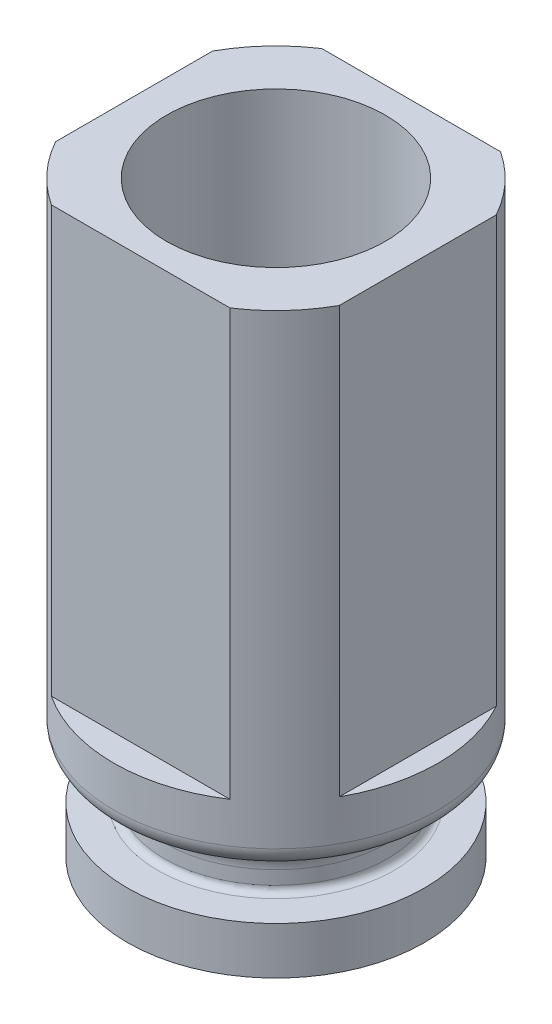
ISO-10303-21;
HEADER;
FILE_DESCRIPTION(('STEP AP214'),'2;1');
FILE_NAME('part.step','',(''),(''),'','','');
FILE_SCHEMA(('AUTOMOTIVE_DESIGN { 1 0 10303 214 1 1 1 1 }'));
ENDSEC;
DATA;
#1=APPLICATION_CONTEXT('core data for automotive mechanical design processes');
#2=APPLICATION_PROTOCOL_DEFINITION('international standard','automotive_design',2000,#1);
#3=PRODUCT_CONTEXT('',#1,'mechanical');
#4=PRODUCT('Part','Part','',(#3));
#5=PRODUCT_RELATED_PRODUCT_CATEGORY('part','',(#4));
#6=PRODUCT_DEFINITION_FORMATION('','',#4);
#7=PRODUCT_DEFINITION_CONTEXT('part definition',#1,'design');
#8=PRODUCT_DEFINITION('design','',#6,#7);
#9=PRODUCT_DEFINITION_SHAPE('','',#8);
#10=(LENGTH_UNIT() NAMED_UNIT(*) SI_UNIT(.MILLI.,.METRE.));
#11=(NAMED_UNIT(*) PLANE_ANGLE_UNIT() SI_UNIT($,.RADIAN.));
#12=(NAMED_UNIT(*) SI_UNIT($,.STERADIAN.) SOLID_ANGLE_UNIT());
#13=UNCERTAINTY_MEASURE_WITH_UNIT(LENGTH_MEASURE(1.E-05),#10,'distance_accuracy_value','');
#14=(GEOMETRIC_REPRESENTATION_CONTEXT(3) GLOBAL_UNCERTAINTY_ASSIGNED_CONTEXT((#13)) GLOBAL_UNIT_ASSIGNED_CONTEXT((#10,
#11,#12)) REPRESENTATION_CONTEXT('',''));
#15=CARTESIAN_POINT('',(0.,0.,0.));
#16=DIRECTION('',(0.,0.,1.));
#17=DIRECTION('',(1.,0.,0.));
#18=AXIS2_PLACEMENT_3D('',#15,#16,#17);
#19=CARTESIAN_POINT('',(0.,87.,0.));
#20=DIRECTION('',(0.,1.,0.));
#21=DIRECTION('',(0.,0.,1.));
#22=AXIS2_PLACEMENT_3D('',#19,#20,#21);
#23=PLANE('',#22);
#24=CARTESIAN_POINT('',(0.,87.,0.));
#25=DIRECTION('',(0.,1.,0.));
#26=DIRECTION('',(0.,0.,1.));
#27=AXIS2_PLACEMENT_3D('',#24,#25,#26);
#28=CIRCLE('',#27,16.2);
#29=CARTESIAN_POINT('',(0.,87.,16.2));
#30=VERTEX_POINT('',#29);
#31=EDGE_CURVE('E149',#30,#30,#28,.T.);
#32=ORIENTED_EDGE('',*,*,#31,.F.);
#33=EDGE_LOOP('',(#32));
#34=FACE_BOUND('',#33,.T.);
#35=CARTESIAN_POINT('',(0.,87.,0.));
#36=DIRECTION('',(0.,1.,0.));
#37=DIRECTION('',(0.,0.,1.));
#38=AXIS2_PLACEMENT_3D('',#35,#36,#37);
#39=CIRCLE('',#38,24.);
#40=CARTESIAN_POINT('',(21.,87.,-11.6189500386223));
#41=VERTEX_POINT('',#40);
#42=CARTESIAN_POINT('',(13.2177418201175,87.,-20.0322565173451));
#43=VERTEX_POINT('',#42);
#44=EDGE_CURVE('E148',#41,#43,#39,.T.);
#45=ORIENTED_EDGE('',*,*,#44,.T.);
#46=DIRECTION('',(-1.,0.,0.));
#47=VECTOR('',#46,1.);
#48=CARTESIAN_POINT('',(0.,87.,-20.0322565173451));
#49=LINE('',#48,#47);
#50=CARTESIAN_POINT('',(-13.2177418201175,87.,-20.0322565173451));
#51=VERTEX_POINT('',#50);
#52=EDGE_CURVE('E143',#43,#51,#49,.T.);
#53=ORIENTED_EDGE('',*,*,#52,.T.);
#54=CARTESIAN_POINT('',(-21.,87.,-11.6189500386223));
#55=VERTEX_POINT('',#54);
#56=EDGE_CURVE('E146',#51,#55,#39,.T.);
#57=ORIENTED_EDGE('',*,*,#56,.T.);
#58=DIRECTION('',(0.,0.,1.));
#59=VECTOR('',#58,1.);
#60=CARTESIAN_POINT('',(-21.,87.,0.));
#61=LINE('',#60,#59);
#62=CARTESIAN_POINT('',(-21.,87.,11.6189500386222));
#63=VERTEX_POINT('',#62);
#64=EDGE_CURVE('E101',#55,#63,#61,.T.);
#65=ORIENTED_EDGE('',*,*,#64,.T.);
#66=CARTESIAN_POINT('',(-13.2177418201175,87.,20.0322565173451));
#67=VERTEX_POINT('',#66);
#68=EDGE_CURVE('E152',#63,#67,#39,.T.);
#69=ORIENTED_EDGE('',*,*,#68,.T.);
#70=DIRECTION('',(1.,0.,0.));
#71=VECTOR('',#70,1.);
#72=CARTESIAN_POINT('',(0.,87.,20.0322565173451));
#73=LINE('',#72,#71);
#74=CARTESIAN_POINT('',(13.2177418201175,87.,20.0322565173451));
#75=VERTEX_POINT('',#74);
#76=EDGE_CURVE('E407',#67,#75,#73,.T.);
#77=ORIENTED_EDGE('',*,*,#76,.T.);
#78=CARTESIAN_POINT('',(21.,87.,11.6189500386222));
#79=VERTEX_POINT('',#78);
#80=EDGE_CURVE('E154',#75,#79,#39,.T.);
#81=ORIENTED_EDGE('',*,*,#80,.T.);
#82=DIRECTION('',(0.,0.,-1.));
#83=VECTOR('',#82,1.);
#84=CARTESIAN_POINT('',(21.,87.,0.));
#85=LINE('',#84,#83);
#86=EDGE_CURVE('E150',#79,#41,#85,.T.);
#87=ORIENTED_EDGE('',*,*,#86,.T.);
#88=EDGE_LOOP('',(#45,#53,#57,#65,#69,#77,#81,#87));
#89=FACE_BOUND('',#88,.T.);
#90=ADVANCED_FACE('F32',(#34,#89),#23,.T.);
#91=CARTESIAN_POINT('',(0.,87.,0.));
#92=DIRECTION('',(0.,-1.,0.));
#93=DIRECTION('',(0.,0.,-1.));
#94=AXIS2_PLACEMENT_3D('',#91,#92,#93);
#95=CYLINDRICAL_SURFACE('',#94,24.);
#96=CARTESIAN_POINT('',(0.,17.9843597113357,0.));
#97=DIRECTION('',(0.,-1.,0.));
#98=DIRECTION('',(0.,0.,-1.));
#99=AXIS2_PLACEMENT_3D('',#96,#97,#98);
#100=CIRCLE('',#99,24.);
#101=CARTESIAN_POINT('',(0.,17.9843597113357,-24.));
#102=VERTEX_POINT('',#101);
#103=EDGE_CURVE('E183',#102,#102,#100,.F.);
#104=ORIENTED_EDGE('',*,*,#103,.T.);
#105=EDGE_LOOP('',(#104));
#106=FACE_BOUND('',#105,.T.);
#107=DIRECTION('',(0.,-1.,0.));
#108=VECTOR('',#107,1.);
#109=CARTESIAN_POINT('',(13.2177418201175,87.,-20.0322565173451));
#110=LINE('',#109,#108);
#111=CARTESIAN_POINT('',(13.2177418201175,24.,-20.0322565173451));
#112=VERTEX_POINT('',#111);
#113=EDGE_CURVE('E11',#43,#112,#110,.T.);
#114=ORIENTED_EDGE('',*,*,#113,.F.);
#115=ORIENTED_EDGE('',*,*,#44,.F.);
#116=DIRECTION('',(0.,-1.,0.));
#117=VECTOR('',#116,1.);
#118=CARTESIAN_POINT('',(21.,87.,-11.6189500386223));
#119=LINE('',#118,#117);
#120=CARTESIAN_POINT('',(21.,24.,-11.6189500386223));
#121=VERTEX_POINT('',#120);
#122=EDGE_CURVE('E130',#121,#41,#119,.F.);
#123=ORIENTED_EDGE('',*,*,#122,.F.);
#124=CARTESIAN_POINT('',(0.,24.,0.));
#125=DIRECTION('',(0.,-1.,0.));
#126=DIRECTION('',(0.,0.,-1.));
#127=AXIS2_PLACEMENT_3D('',#124,#125,#126);
#128=CIRCLE('',#127,24.);
#129=CARTESIAN_POINT('',(21.,24.,11.6189500386222));
#130=VERTEX_POINT('',#129);
#131=EDGE_CURVE('E124',#121,#130,#128,.T.);
#132=ORIENTED_EDGE('',*,*,#131,.T.);
#133=DIRECTION('',(0.,-1.,0.));
#134=VECTOR('',#133,1.);
#135=CARTESIAN_POINT('',(21.,87.,11.6189500386222));
#136=LINE('',#135,#134);
#137=EDGE_CURVE('E134',#79,#130,#136,.T.);
#138=ORIENTED_EDGE('',*,*,#137,.F.);
#139=ORIENTED_EDGE('',*,*,#80,.F.);
#140=DIRECTION('',(0.,-1.,0.));
#141=VECTOR('',#140,1.);
#142=CARTESIAN_POINT('',(13.2177418201175,87.,20.0322565173451));
#143=LINE('',#142,#141);
#144=CARTESIAN_POINT('',(13.2177418201175,24.,20.0322565173451));
#145=VERTEX_POINT('',#144);
#146=EDGE_CURVE('E106',#145,#75,#143,.F.);
#147=ORIENTED_EDGE('',*,*,#146,.F.);
#148=CARTESIAN_POINT('',(-13.2177418201175,24.,20.0322565173451));
#149=VERTEX_POINT('',#148);
#150=EDGE_CURVE('E119',#145,#149,#128,.T.);
#151=ORIENTED_EDGE('',*,*,#150,.T.);
#152=DIRECTION('',(0.,-1.,0.));
#153=VECTOR('',#152,1.);
#154=CARTESIAN_POINT('',(-13.2177418201175,87.,20.0322565173451));
#155=LINE('',#154,#153);
#156=EDGE_CURVE('E126',#67,#149,#155,.T.);
#157=ORIENTED_EDGE('',*,*,#156,.F.);
#158=ORIENTED_EDGE('',*,*,#68,.F.);
#159=DIRECTION('',(0.,-1.,0.));
#160=VECTOR('',#159,1.);
#161=CARTESIAN_POINT('',(-21.,87.,11.6189500386222));
#162=LINE('',#161,#160);
#163=CARTESIAN_POINT('',(-21.,24.,11.6189500386222));
#164=VERTEX_POINT('',#163);
#165=EDGE_CURVE('E117',#164,#63,#162,.F.);
#166=ORIENTED_EDGE('',*,*,#165,.F.);
#167=CARTESIAN_POINT('',(-21.,24.,-11.6189500386223));
#168=VERTEX_POINT('',#167);
#169=EDGE_CURVE('E107',#164,#168,#128,.T.);
#170=ORIENTED_EDGE('',*,*,#169,.T.);
#171=DIRECTION('',(0.,-1.,0.));
#172=VECTOR('',#171,1.);
#173=CARTESIAN_POINT('',(-21.,87.,-11.6189500386223));
#174=LINE('',#173,#172);
#175=EDGE_CURVE('E95',#55,#168,#174,.T.);
#176=ORIENTED_EDGE('',*,*,#175,.F.);
#177=ORIENTED_EDGE('',*,*,#56,.F.);
#178=DIRECTION('',(0.,-1.,0.));
#179=VECTOR('',#178,1.);
#180=CARTESIAN_POINT('',(-13.2177418201175,87.,-20.0322565173451));
#181=LINE('',#180,#179);
#182=CARTESIAN_POINT('',(-13.2177418201175,24.,-20.0322565173451));
#183=VERTEX_POINT('',#182);
#184=EDGE_CURVE('E123',#183,#51,#181,.F.);
#185=ORIENTED_EDGE('',*,*,#184,.F.);
#186=EDGE_CURVE('E40',#183,#112,#128,.T.);
#187=ORIENTED_EDGE('',*,*,#186,.T.);
#188=EDGE_LOOP('',(#114,#115,#123,#132,#138,#139,#147,#151,#157,#158,#166,#170,#176,#177,#185,#187));
#189=FACE_BOUND('',#188,.T.);
#190=ADVANCED_FACE('F115',(#106,#189),#95,.T.);
#191=CARTESIAN_POINT('',(0.,15.,0.));
#192=DIRECTION('',(0.,-1.,0.));
#193=DIRECTION('',(0.,0.,-1.));
#194=AXIS2_PLACEMENT_3D('',#191,#192,#193);
#195=CYLINDRICAL_SURFACE('',#194,22.);
#196=CARTESIAN_POINT('',(0.,0.,0.));
#197=DIRECTION('',(0.,1.,0.));
#198=DIRECTION('',(0.,0.,1.));
#199=AXIS2_PLACEMENT_3D('',#196,#197,#198);
#200=CIRCLE('',#199,22.);
#201=CARTESIAN_POINT('',(0.,0.,22.));
#202=VERTEX_POINT('',#201);
#203=EDGE_CURVE('E163',#202,#202,#200,.T.);
#204=ORIENTED_EDGE('',*,*,#203,.T.);
#205=EDGE_LOOP('',(#204));
#206=FACE_BOUND('',#205,.T.);
#207=CARTESIAN_POINT('',(0.,7.,0.));
#208=DIRECTION('',(0.,1.,0.));
#209=DIRECTION('',(0.,0.,1.));
#210=AXIS2_PLACEMENT_3D('',#207,#208,#209);
#211=CIRCLE('',#210,22.);
#212=CARTESIAN_POINT('',(0.,7.,22.));
#213=VERTEX_POINT('',#212);
#214=EDGE_CURVE('E159',#213,#213,#211,.T.);
#215=ORIENTED_EDGE('',*,*,#214,.F.);
#216=EDGE_LOOP('',(#215));
#217=FACE_BOUND('',#216,.T.);
#218=ADVANCED_FACE('F197',(#206,#217),#195,.T.);
#219=CARTESIAN_POINT('',(0.,0.,0.));
#220=DIRECTION('',(0.,1.,0.));
#221=DIRECTION('',(0.,0.,1.));
#222=AXIS2_PLACEMENT_3D('',#219,#220,#221);
#223=PLANE('',#222);
#224=CARTESIAN_POINT('',(0.,0.,0.));
#225=DIRECTION('',(0.,-1.,0.));
#226=DIRECTION('',(0.,0.,-1.));
#227=AXIS2_PLACEMENT_3D('',#224,#225,#226);
#228=CIRCLE('',#227,14.5);
#229=CARTESIAN_POINT('',(0.,0.,-14.5));
#230=VERTEX_POINT('',#229);
#231=EDGE_CURVE('E164',#230,#230,#228,.T.);
#232=ORIENTED_EDGE('',*,*,#231,.F.);
#233=EDGE_LOOP('',(#232));
#234=FACE_BOUND('',#233,.T.);
#235=ORIENTED_EDGE('',*,*,#203,.F.);
#236=EDGE_LOOP('',(#235));
#237=FACE_BOUND('',#236,.T.);
#238=ADVANCED_FACE('F203',(#234,#237),#223,.F.);
#239=CARTESIAN_POINT('',(0.,6.5,0.));
#240=DIRECTION('',(0.,-1.,0.));
#241=DIRECTION('',(0.,0.,-1.));
#242=AXIS2_PLACEMENT_3D('',#239,#240,#241);
#243=CYLINDRICAL_SURFACE('',#242,14.5);
#244=CARTESIAN_POINT('',(0.,6.5,0.));
#245=DIRECTION('',(0.,-1.,0.));
#246=DIRECTION('',(0.,0.,-1.));
#247=AXIS2_PLACEMENT_3D('',#244,#245,#246);
#248=CIRCLE('',#247,14.5);
#249=CARTESIAN_POINT('',(0.,6.5,-14.5));
#250=VERTEX_POINT('',#249);
#251=EDGE_CURVE('E160',#250,#250,#248,.T.);
#252=CARTESIAN_POINT('',(0.,6.5,-14.5));
#253=CARTESIAN_POINT('',(0.,6.43229166666667,-14.5));
#254=CARTESIAN_POINT('',(0.,6.36458333333333,-14.5));
#255=CARTESIAN_POINT('',(0.,6.22916666666667,-14.5));
#256=CARTESIAN_POINT('',(0.,6.16145833333333,-14.5));
#257=CARTESIAN_POINT('',(0.,6.02604166666667,-14.5));
#258=CARTESIAN_POINT('',(0.,5.95833333333333,-14.5));
#259=CARTESIAN_POINT('',(0.,5.82291666666667,-14.5));
#260=CARTESIAN_POINT('',(0.,5.75520833333333,-14.5));
#261=CARTESIAN_POINT('',(0.,5.61979166666667,-14.5));
#262=CARTESIAN_POINT('',(0.,5.55208333333333,-14.5));
#263=CARTESIAN_POINT('',(0.,5.41666666666667,-14.5));
#264=CARTESIAN_POINT('',(0.,5.34895833333333,-14.5));
#265=CARTESIAN_POINT('',(0.,5.21354166666667,-14.5));
#266=CARTESIAN_POINT('',(0.,5.14583333333333,-14.5));
#267=CARTESIAN_POINT('',(0.,5.01041666666667,-14.5));
#268=CARTESIAN_POINT('',(0.,4.94270833333333,-14.5));
#269=CARTESIAN_POINT('',(0.,4.80729166666667,-14.5));
#270=CARTESIAN_POINT('',(0.,4.73958333333333,-14.5));
#271=CARTESIAN_POINT('',(0.,4.60416666666667,-14.5));
#272=CARTESIAN_POINT('',(0.,4.53645833333333,-14.5));
#273=CARTESIAN_POINT('',(0.,4.40104166666667,-14.5));
#274=CARTESIAN_POINT('',(0.,4.33333333333333,-14.5));
#275=CARTESIAN_POINT('',(0.,4.19791666666667,-14.5));
#276=CARTESIAN_POINT('',(0.,4.13020833333333,-14.5));
#277=CARTESIAN_POINT('',(0.,3.99479166666667,-14.5));
#278=CARTESIAN_POINT('',(0.,3.92708333333333,-14.5));
#279=CARTESIAN_POINT('',(0.,3.79166666666667,-14.5));
#280=CARTESIAN_POINT('',(0.,3.72395833333333,-14.5));
#281=CARTESIAN_POINT('',(0.,3.58854166666667,-14.5));
#282=CARTESIAN_POINT('',(0.,3.52083333333333,-14.5));
#283=CARTESIAN_POINT('',(0.,3.38541666666667,-14.5));
#284=CARTESIAN_POINT('',(0.,3.31770833333333,-14.5));
#285=CARTESIAN_POINT('',(0.,3.18229166666667,-14.5));
#286=CARTESIAN_POINT('',(0.,3.11458333333333,-14.5));
#287=CARTESIAN_POINT('',(0.,2.97916666666667,-14.5));
#288=CARTESIAN_POINT('',(0.,2.91145833333333,-14.5));
#289=CARTESIAN_POINT('',(0.,2.77604166666667,-14.5));
#290=CARTESIAN_POINT('',(0.,2.70833333333333,-14.5));
#291=CARTESIAN_POINT('',(0.,2.57291666666667,-14.5));
#292=CARTESIAN_POINT('',(0.,2.50520833333333,-14.5));
#293=CARTESIAN_POINT('',(0.,2.36979166666667,-14.5));
#294=CARTESIAN_POINT('',(0.,2.30208333333333,-14.5));
#295=CARTESIAN_POINT('',(0.,2.16666666666667,-14.5));
#296=CARTESIAN_POINT('',(0.,2.09895833333333,-14.5));
#297=CARTESIAN_POINT('',(0.,1.96354166666667,-14.5));
#298=CARTESIAN_POINT('',(0.,1.89583333333333,-14.5));
#299=CARTESIAN_POINT('',(0.,1.76041666666667,-14.5));
#300=CARTESIAN_POINT('',(0.,1.69270833333333,-14.5));
#301=CARTESIAN_POINT('',(0.,1.55729166666667,-14.5));
#302=CARTESIAN_POINT('',(0.,1.48958333333333,-14.5));
#303=CARTESIAN_POINT('',(0.,1.35416666666667,-14.5));
#304=CARTESIAN_POINT('',(0.,1.28645833333333,-14.5));
#305=CARTESIAN_POINT('',(0.,1.15104166666667,-14.5));
#306=CARTESIAN_POINT('',(0.,1.08333333333333,-14.5));
#307=CARTESIAN_POINT('',(0.,0.947916666666667,-14.5));
#308=CARTESIAN_POINT('',(0.,0.880208333333333,-14.5));
#309=CARTESIAN_POINT('',(0.,0.744791666666667,-14.5));
#310=CARTESIAN_POINT('',(0.,0.677083333333334,-14.5));
#311=CARTESIAN_POINT('',(0.,0.541666666666667,-14.5));
#312=CARTESIAN_POINT('',(0.,0.473958333333334,-14.5));
#313=CARTESIAN_POINT('',(0.,0.338541666666667,-14.5));
#314=CARTESIAN_POINT('',(0.,0.270833333333334,-14.5));
#315=CARTESIAN_POINT('',(0.,0.135416666666667,-14.5));
#316=CARTESIAN_POINT('',(0.,0.0677083333333333,-14.5));
#317=CARTESIAN_POINT('',(0.,0.,-14.5));
#318=B_SPLINE_CURVE_WITH_KNOTS('',3,(#252,#253,#254,#255,#256,#257,#258,#259,#260,#261,#262,
#263,#264,#265,#266,#267,#268,#269,#270,#271,#272,#273,#274,#275,#276,#277,#278,#279,#280,#281,
#282,#283,#284,#285,#286,#287,#288,#289,#290,#291,#292,#293,#294,#295,#296,#297,#298,#299,#300,
#301,#302,#303,#304,#305,#306,#307,#308,#309,#310,#311,#312,#313,#314,#315,#316,#317),
.UNSPECIFIED.,.F.,.F.,(4,2,2,2,2,2,2,2,2,2,2,2,2,2,2,2,2,2,2,2,2,2,2,2,2,2,2,2,2,2,2,2,4),(0.,
0.203125,0.40625,0.609375000000001,0.812500000000001,1.015625,1.21875,1.421875,1.625,1.828125,
2.03125,2.234375,2.4375,2.640625,2.84375,3.046875,3.25,3.453125,3.65625,3.859375,4.0625,
4.265625,4.46875,4.671875,4.875,5.078125,5.28125,5.484375,5.6875,5.890625,6.09375,6.296875,6.5),.UNSPECIFIED.);
#319=EDGE_CURVE('BSEAM222',#250,#230,#318,.T.);
#320=ORIENTED_EDGE('',*,*,#251,.F.);
#321=ORIENTED_EDGE('',*,*,#231,.T.);
#322=ORIENTED_EDGE('',*,*,#319,.T.);
#323=ORIENTED_EDGE('',*,*,#319,.F.);
#324=EDGE_LOOP('',(#320,#322,#321,#323));
#325=FACE_BOUND('',#324,.T.);
#326=ADVANCED_FACE('F222',(#325),#243,.F.);
#327=CARTESIAN_POINT('',(0.,6.5,0.));
#328=DIRECTION('',(0.,-1.,0.));
#329=DIRECTION('',(0.,0.,-1.));
#330=AXIS2_PLACEMENT_3D('',#327,#328,#329);
#331=PLANE('',#330);
#332=ORIENTED_EDGE('',*,*,#251,.T.);
#333=EDGE_LOOP('',(#332));
#334=FACE_BOUND('',#333,.T.);
#335=ADVANCED_FACE('F218',(#334),#331,.T.);
#336=CARTESIAN_POINT('',(0.,7.,0.));
#337=DIRECTION('',(0.,1.,0.));
#338=DIRECTION('',(0.,0.,1.));
#339=AXIS2_PLACEMENT_3D('',#336,#337,#338);
#340=PLANE('',#339);
#341=CARTESIAN_POINT('',(0.,7.,0.));
#342=DIRECTION('',(0.,1.,0.));
#343=DIRECTION('',(0.,0.,1.));
#344=AXIS2_PLACEMENT_3D('',#341,#342,#343);
#345=CIRCLE('',#344,17.5);
#346=CARTESIAN_POINT('',(0.,7.,17.5));
#347=VERTEX_POINT('',#346);
#348=EDGE_CURVE('E177',#347,#347,#345,.F.);
#349=ORIENTED_EDGE('',*,*,#348,.T.);
#350=EDGE_LOOP('',(#349));
#351=FACE_BOUND('',#350,.T.);
#352=ORIENTED_EDGE('',*,*,#214,.T.);
#353=EDGE_LOOP('',(#352));
#354=FACE_BOUND('',#353,.T.);
#355=ADVANCED_FACE('F214',(#351,#354),#340,.T.);
#356=CARTESIAN_POINT('',(0.,7.,0.));
#357=DIRECTION('',(0.,1.,0.));
#358=DIRECTION('',(0.,0.,1.));
#359=AXIS2_PLACEMENT_3D('',#356,#357,#358);
#360=CYLINDRICAL_SURFACE('',#359,16.5);
#361=CARTESIAN_POINT('',(0.,10.,0.));
#362=DIRECTION('',(0.,1.,0.));
#363=DIRECTION('',(0.,0.,1.));
#364=AXIS2_PLACEMENT_3D('',#361,#362,#363);
#365=CIRCLE('',#364,16.5);
#366=CARTESIAN_POINT('',(0.,10.,16.5));
#367=VERTEX_POINT('',#366);
#368=EDGE_CURVE('E180',#367,#367,#365,.F.);
#369=ORIENTED_EDGE('',*,*,#368,.T.);
#370=EDGE_LOOP('',(#369));
#371=FACE_BOUND('',#370,.T.);
#372=CARTESIAN_POINT('',(0.,8.,0.));
#373=DIRECTION('',(0.,1.,0.));
#374=DIRECTION('',(0.,0.,1.));
#375=AXIS2_PLACEMENT_3D('',#372,#373,#374);
#376=CIRCLE('',#375,16.5);
#377=CARTESIAN_POINT('',(0.,8.,16.5));
#378=VERTEX_POINT('',#377);
#379=EDGE_CURVE('E174',#378,#378,#376,.T.);
#380=ORIENTED_EDGE('',*,*,#379,.T.);
#381=EDGE_LOOP('',(#380));
#382=FACE_BOUND('',#381,.T.);
#383=ADVANCED_FACE('F210',(#371,#382),#360,.T.);
#384=CARTESIAN_POINT('',(0.,87.,0.));
#385=DIRECTION('',(0.,-1.,0.));
#386=DIRECTION('',(0.,0.,-1.));
#387=AXIS2_PLACEMENT_3D('',#384,#385,#386);
#388=CYLINDRICAL_SURFACE('',#387,16.2);
#389=ORIENTED_EDGE('',*,*,#31,.T.);
#390=EDGE_LOOP('',(#389));
#391=FACE_BOUND('',#390,.T.);
#392=CARTESIAN_POINT('',(0.,15.,0.));
#393=DIRECTION('',(0.,1.,0.));
#394=DIRECTION('',(0.,0.,1.));
#395=AXIS2_PLACEMENT_3D('',#392,#393,#394);
#396=CIRCLE('',#395,16.2);
#397=CARTESIAN_POINT('',(0.,15.,16.2));
#398=VERTEX_POINT('',#397);
#399=EDGE_CURVE('E169',#398,#398,#396,.F.);
#400=ORIENTED_EDGE('',*,*,#399,.T.);
#401=EDGE_LOOP('',(#400));
#402=FACE_BOUND('',#401,.T.);
#403=ADVANCED_FACE('F213',(#391,#402),#388,.F.);
#404=CARTESIAN_POINT('',(0.,15.,0.));
#405=DIRECTION('',(0.,1.,0.));
#406=DIRECTION('',(0.,0.,1.));
#407=AXIS2_PLACEMENT_3D('',#404,#405,#406);
#408=PLANE('',#407);
#409=ORIENTED_EDGE('',*,*,#399,.F.);
#410=EDGE_LOOP('',(#409));
#411=FACE_BOUND('',#410,.T.);
#412=ADVANCED_FACE('F227',(#411),#408,.T.);
#413=CARTESIAN_POINT('',(0.,8.,0.));
#414=DIRECTION('',(0.,1.,0.));
#415=DIRECTION('',(0.,0.,1.));
#416=AXIS2_PLACEMENT_3D('',#413,#414,#415);
#417=TOROIDAL_SURFACE('',#416,17.5,1.);
#418=ORIENTED_EDGE('',*,*,#348,.F.);
#419=EDGE_LOOP('',(#418));
#420=FACE_BOUND('',#419,.T.);
#421=ORIENTED_EDGE('',*,*,#379,.F.);
#422=EDGE_LOOP('',(#421));
#423=FACE_BOUND('',#422,.T.);
#424=ADVANCED_FACE('F230',(#420,#423),#417,.F.);
#425=CARTESIAN_POINT('',(0.,10.,0.));
#426=DIRECTION('',(0.,1.,0.));
#427=DIRECTION('',(0.,0.,1.));
#428=AXIS2_PLACEMENT_3D('',#425,#426,#427);
#429=TOROIDAL_SURFACE('',#428,21.5,5.);
#430=CARTESIAN_POINT('',(0.,14.9902248195832,0.));
#431=DIRECTION('',(0.,-1.,0.));
#432=DIRECTION('',(0.,0.,-1.));
#433=AXIS2_PLACEMENT_3D('',#430,#431,#432);
#434=CIRCLE('',#433,21.1875000000001);
#435=CARTESIAN_POINT('',(0.,14.9902248195832,-21.1875000000001));
#436=VERTEX_POINT('',#435);
#437=EDGE_CURVE('E120',#436,#436,#434,.T.);
#438=ORIENTED_EDGE('',*,*,#437,.T.);
#439=EDGE_LOOP('',(#438));
#440=FACE_BOUND('',#439,.T.);
#441=ORIENTED_EDGE('',*,*,#368,.F.);
#442=EDGE_LOOP('',(#441));
#443=FACE_BOUND('',#442,.T.);
#444=ADVANCED_FACE('F189',(#440,#443),#429,.F.);
#445=CARTESIAN_POINT('',(0.,17.9843597113357,0.));
#446=DIRECTION('',(0.,-1.,0.));
#447=DIRECTION('',(0.,0.,-1.));
#448=AXIS2_PLACEMENT_3D('',#445,#446,#447);
#449=TOROIDAL_SURFACE('',#448,21.,3.);
#450=ORIENTED_EDGE('',*,*,#437,.F.);
#451=EDGE_LOOP('',(#450));
#452=FACE_BOUND('',#451,.T.);
#453=ORIENTED_EDGE('',*,*,#103,.F.);
#454=EDGE_LOOP('',(#453));
#455=FACE_BOUND('',#454,.T.);
#456=ADVANCED_FACE('F34',(#452,#455),#449,.T.);
#457=CARTESIAN_POINT('',(-21.,24.,-20.0322565173451));
#458=DIRECTION('',(-1.,0.,0.));
#459=DIRECTION('',(0.,0.,1.));
#460=AXIS2_PLACEMENT_3D('',#457,#458,#459);
#461=PLANE('',#460);
#462=ORIENTED_EDGE('',*,*,#175,.T.);
#463=DIRECTION('',(0.,0.,1.));
#464=VECTOR('',#463,1.);
#465=CARTESIAN_POINT('',(-21.,24.,-20.0322565173451));
#466=LINE('',#465,#464);
#467=EDGE_CURVE('E98',#168,#164,#466,.T.);
#468=ORIENTED_EDGE('',*,*,#467,.T.);
#469=ORIENTED_EDGE('',*,*,#165,.T.);
#470=ORIENTED_EDGE('',*,*,#64,.F.);
#471=EDGE_LOOP('',(#462,#468,#469,#470));
#472=FACE_BOUND('',#471,.T.);
#473=ADVANCED_FACE('F97',(#472),#461,.T.);
#474=CARTESIAN_POINT('',(36.425926693778,24.,-29.701884449259));
#475=DIRECTION('',(0.,-1.,0.));
#476=DIRECTION('',(0.,0.,-1.));
#477=AXIS2_PLACEMENT_3D('',#474,#475,#476);
#478=PLANE('',#477);
#479=ORIENTED_EDGE('',*,*,#467,.F.);
#480=ORIENTED_EDGE('',*,*,#169,.F.);
#481=EDGE_LOOP('',(#479,#480));
#482=FACE_BOUND('',#481,.T.);
#483=ADVANCED_FACE('F110',(#482),#478,.F.);
#484=CARTESIAN_POINT('',(-21.,24.,20.0322565173451));
#485=DIRECTION('',(0.,0.,1.));
#486=DIRECTION('',(1.,0.,0.));
#487=AXIS2_PLACEMENT_3D('',#484,#485,#486);
#488=PLANE('',#487);
#489=ORIENTED_EDGE('',*,*,#156,.T.);
#490=DIRECTION('',(1.,0.,0.));
#491=VECTOR('',#490,1.);
#492=CARTESIAN_POINT('',(-21.,24.,20.0322565173451));
#493=LINE('',#492,#491);
#494=EDGE_CURVE('E112',#149,#145,#493,.T.);
#495=ORIENTED_EDGE('',*,*,#494,.T.);
#496=ORIENTED_EDGE('',*,*,#146,.T.);
#497=ORIENTED_EDGE('',*,*,#76,.F.);
#498=EDGE_LOOP('',(#489,#495,#496,#497));
#499=FACE_BOUND('',#498,.T.);
#500=ADVANCED_FACE('F260',(#499),#488,.T.);
#501=ORIENTED_EDGE('',*,*,#494,.F.);
#502=ORIENTED_EDGE('',*,*,#150,.F.);
#503=EDGE_LOOP('',(#501,#502));
#504=FACE_BOUND('',#503,.T.);
#505=ADVANCED_FACE('F263',(#504),#478,.F.);
#506=CARTESIAN_POINT('',(21.,24.,-20.0322565173451));
#507=DIRECTION('',(1.,0.,0.));
#508=DIRECTION('',(0.,0.,-1.));
#509=AXIS2_PLACEMENT_3D('',#506,#507,#508);
#510=PLANE('',#509);
#511=ORIENTED_EDGE('',*,*,#137,.T.);
#512=DIRECTION('',(0.,0.,-1.));
#513=VECTOR('',#512,1.);
#514=CARTESIAN_POINT('',(21.,24.,-20.0322565173451));
#515=LINE('',#514,#513);
#516=EDGE_CURVE('E54',#130,#121,#515,.T.);
#517=ORIENTED_EDGE('',*,*,#516,.T.);
#518=ORIENTED_EDGE('',*,*,#122,.T.);
#519=ORIENTED_EDGE('',*,*,#86,.F.);
#520=EDGE_LOOP('',(#511,#517,#518,#519));
#521=FACE_BOUND('',#520,.T.);
#522=ADVANCED_FACE('F276',(#521),#510,.T.);
#523=ORIENTED_EDGE('',*,*,#516,.F.);
#524=ORIENTED_EDGE('',*,*,#131,.F.);
#525=EDGE_LOOP('',(#523,#524));
#526=FACE_BOUND('',#525,.T.);
#527=ADVANCED_FACE('F278',(#526),#478,.F.);
#528=DIRECTION('',(-1.,0.,0.));
#529=VECTOR('',#528,1.);
#530=CARTESIAN_POINT('',(-21.,24.,-20.0322565173451));
#531=LINE('',#530,#529);
#532=EDGE_CURVE('E46',#112,#183,#531,.T.);
#533=ORIENTED_EDGE('',*,*,#532,.F.);
#534=ORIENTED_EDGE('',*,*,#186,.F.);
#535=EDGE_LOOP('',(#533,#534));
#536=FACE_BOUND('',#535,.T.);
#537=ADVANCED_FACE('F262',(#536),#478,.F.);
#538=CARTESIAN_POINT('',(-21.,24.,-20.0322565173451));
#539=DIRECTION('',(0.,0.,-1.));
#540=DIRECTION('',(-1.,0.,0.));
#541=AXIS2_PLACEMENT_3D('',#538,#539,#540);
#542=PLANE('',#541);
#543=ORIENTED_EDGE('',*,*,#113,.T.);
#544=ORIENTED_EDGE('',*,*,#532,.T.);
#545=ORIENTED_EDGE('',*,*,#184,.T.);
#546=ORIENTED_EDGE('',*,*,#52,.F.);
#547=EDGE_LOOP('',(#543,#544,#545,#546));
#548=FACE_BOUND('',#547,.T.);
#549=ADVANCED_FACE('F142',(#548),#542,.T.);
#550=CLOSED_SHELL('',(#90,#190,#218,#238,#326,#335,#355,#383,#403,#412,#424,#444,#456,#473,#483,
#500,#505,#522,#527,#537,#549));
#551=MANIFOLD_SOLID_BREP('B2',#550);
#552=ADVANCED_BREP_SHAPE_REPRESENTATION('',(#18,#551),#14);
#553=SHAPE_DEFINITION_REPRESENTATION(#9,#552);
ENDSEC;
END-ISO-10303-21;
